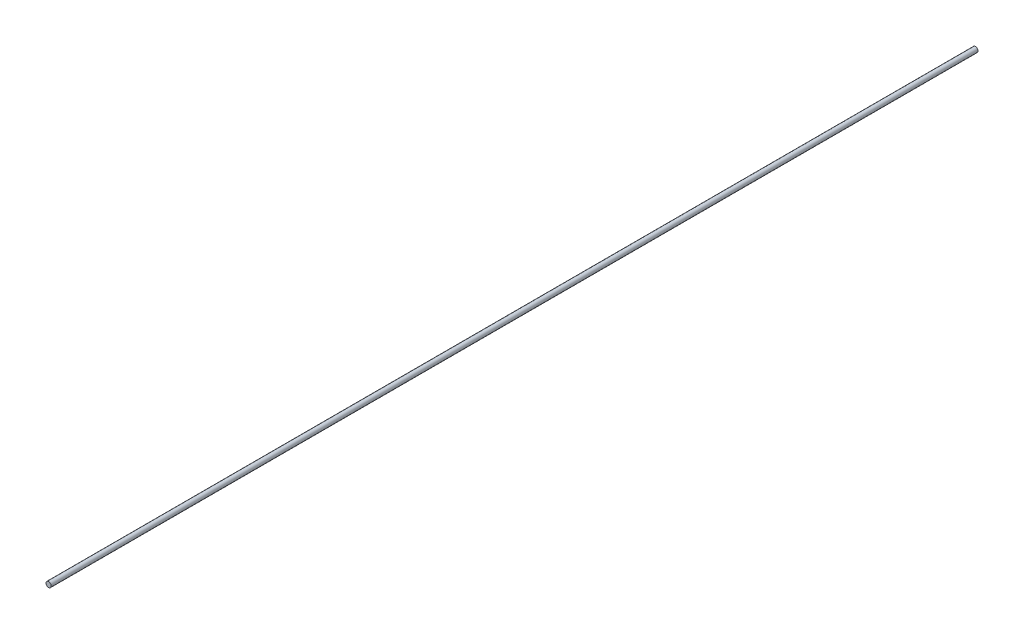
ISO-10303-21;
HEADER;
FILE_DESCRIPTION(('STEP AP214'),'2;1');
FILE_NAME('part.step','',(''),(''),'','','');
FILE_SCHEMA(('AUTOMOTIVE_DESIGN { 1 0 10303 214 1 1 1 1 }'));
ENDSEC;
DATA;
#1=APPLICATION_CONTEXT('core data for automotive mechanical design processes');
#2=APPLICATION_PROTOCOL_DEFINITION('international standard','automotive_design',2000,#1);
#3=PRODUCT_CONTEXT('',#1,'mechanical');
#4=PRODUCT('Part','Part','',(#3));
#5=PRODUCT_RELATED_PRODUCT_CATEGORY('part','',(#4));
#6=PRODUCT_DEFINITION_FORMATION('','',#4);
#7=PRODUCT_DEFINITION_CONTEXT('part definition',#1,'design');
#8=PRODUCT_DEFINITION('design','',#6,#7);
#9=PRODUCT_DEFINITION_SHAPE('','',#8);
#10=(LENGTH_UNIT() NAMED_UNIT(*) SI_UNIT(.MILLI.,.METRE.));
#11=(NAMED_UNIT(*) PLANE_ANGLE_UNIT() SI_UNIT($,.RADIAN.));
#12=(NAMED_UNIT(*) SI_UNIT($,.STERADIAN.) SOLID_ANGLE_UNIT());
#13=UNCERTAINTY_MEASURE_WITH_UNIT(LENGTH_MEASURE(1.E-05),#10,'distance_accuracy_value','');
#14=(GEOMETRIC_REPRESENTATION_CONTEXT(3) GLOBAL_UNCERTAINTY_ASSIGNED_CONTEXT((#13)) GLOBAL_UNIT_ASSIGNED_CONTEXT((#10,
#11,#12)) REPRESENTATION_CONTEXT('',''));
#15=CARTESIAN_POINT('',(0.,0.,0.));
#16=DIRECTION('',(0.,0.,1.));
#17=DIRECTION('',(1.,0.,0.));
#18=AXIS2_PLACEMENT_3D('',#15,#16,#17);
#19=CARTESIAN_POINT('',(0.,0.,360.));
#20=DIRECTION('',(0.,0.,-1.));
#21=DIRECTION('',(-1.,0.,0.));
#22=AXIS2_PLACEMENT_3D('',#19,#20,#21);
#23=CYLINDRICAL_SURFACE('',#22,1.);
#24=CARTESIAN_POINT('',(0.,0.,360.));
#25=DIRECTION('',(0.,0.,1.));
#26=DIRECTION('',(1.,0.,0.));
#27=AXIS2_PLACEMENT_3D('',#24,#25,#26);
#28=CIRCLE('',#27,1.);
#29=CARTESIAN_POINT('',(1.,0.,360.));
#30=VERTEX_POINT('',#29);
#31=EDGE_CURVE('E10',#30,#30,#28,.T.);
#32=ORIENTED_EDGE('',*,*,#31,.F.);
#33=EDGE_LOOP('',(#32));
#34=FACE_BOUND('',#33,.T.);
#35=CARTESIAN_POINT('',(0.,0.,0.));
#36=DIRECTION('',(0.,0.,1.));
#37=DIRECTION('',(1.,0.,0.));
#38=AXIS2_PLACEMENT_3D('',#35,#36,#37);
#39=CIRCLE('',#38,1.);
#40=CARTESIAN_POINT('',(1.,0.,0.));
#41=VERTEX_POINT('',#40);
#42=EDGE_CURVE('E40',#41,#41,#39,.T.);
#43=ORIENTED_EDGE('',*,*,#42,.T.);
#44=EDGE_LOOP('',(#43));
#45=FACE_BOUND('',#44,.T.);
#46=ADVANCED_FACE('F37',(#34,#45),#23,.T.);
#47=CARTESIAN_POINT('',(0.,0.,360.));
#48=DIRECTION('',(0.,0.,1.));
#49=DIRECTION('',(1.,0.,0.));
#50=AXIS2_PLACEMENT_3D('',#47,#48,#49);
#51=PLANE('',#50);
#52=ORIENTED_EDGE('',*,*,#31,.T.);
#53=EDGE_LOOP('',(#52));
#54=FACE_BOUND('',#53,.T.);
#55=ADVANCED_FACE('F54',(#54),#51,.T.);
#56=CARTESIAN_POINT('',(0.,0.,0.));
#57=DIRECTION('',(0.,0.,1.));
#58=DIRECTION('',(1.,0.,0.));
#59=AXIS2_PLACEMENT_3D('',#56,#57,#58);
#60=PLANE('',#59);
#61=ORIENTED_EDGE('',*,*,#42,.F.);
#62=EDGE_LOOP('',(#61));
#63=FACE_BOUND('',#62,.T.);
#64=ADVANCED_FACE('F52',(#63),#60,.F.);
#65=CLOSED_SHELL('',(#46,#55,#64));
#66=MANIFOLD_SOLID_BREP('B2',#65);
#67=ADVANCED_BREP_SHAPE_REPRESENTATION('',(#18,#66),#14);
#68=SHAPE_DEFINITION_REPRESENTATION(#9,#67);
ENDSEC;
END-ISO-10303-21;
